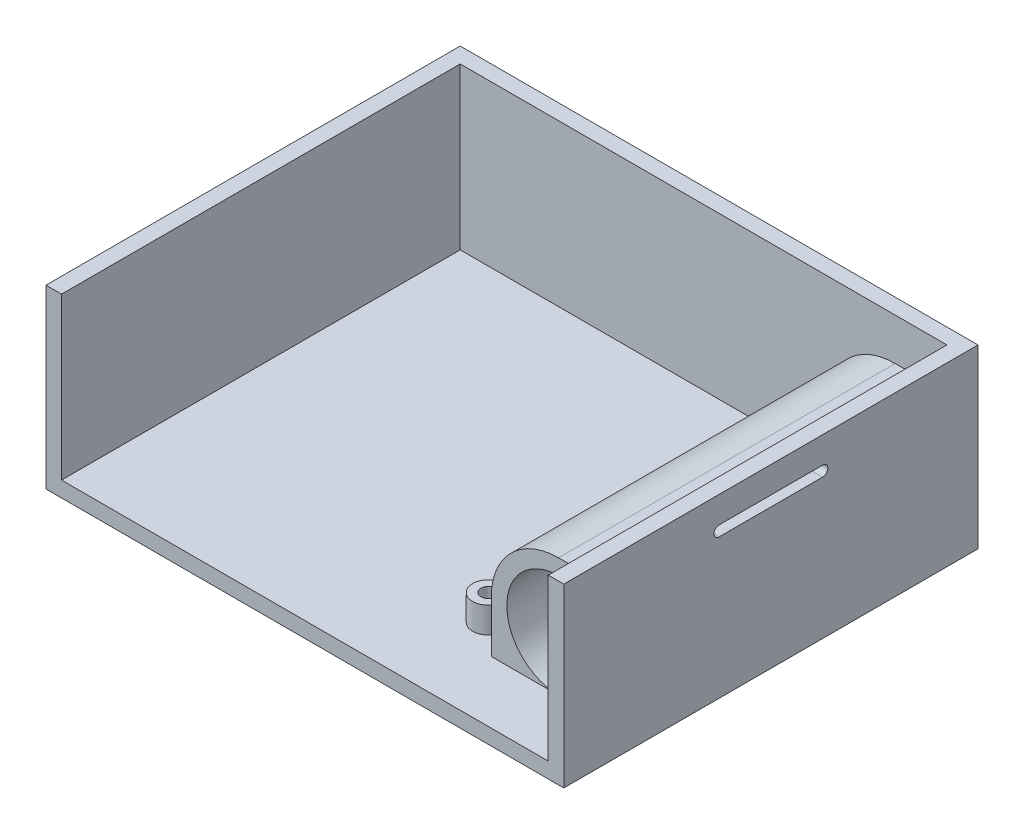
ISO-10303-21;
HEADER;
FILE_DESCRIPTION(('STEP AP214'),'2;1');
FILE_NAME('part.step','',(''),(''),'','','');
FILE_SCHEMA(('AUTOMOTIVE_DESIGN { 1 0 10303 214 1 1 1 1 }'));
ENDSEC;
DATA;
#1=APPLICATION_CONTEXT('core data for automotive mechanical design processes');
#2=APPLICATION_PROTOCOL_DEFINITION('international standard','automotive_design',2000,#1);
#3=PRODUCT_CONTEXT('',#1,'mechanical');
#4=PRODUCT('Part','Part','',(#3));
#5=PRODUCT_RELATED_PRODUCT_CATEGORY('part','',(#4));
#6=PRODUCT_DEFINITION_FORMATION('','',#4);
#7=PRODUCT_DEFINITION_CONTEXT('part definition',#1,'design');
#8=PRODUCT_DEFINITION('design','',#6,#7);
#9=PRODUCT_DEFINITION_SHAPE('','',#8);
#10=(LENGTH_UNIT() NAMED_UNIT(*) SI_UNIT(.MILLI.,.METRE.));
#11=(NAMED_UNIT(*) PLANE_ANGLE_UNIT() SI_UNIT($,.RADIAN.));
#12=(NAMED_UNIT(*) SI_UNIT($,.STERADIAN.) SOLID_ANGLE_UNIT());
#13=UNCERTAINTY_MEASURE_WITH_UNIT(LENGTH_MEASURE(1.E-05),#10,'distance_accuracy_value','');
#14=(GEOMETRIC_REPRESENTATION_CONTEXT(3) GLOBAL_UNCERTAINTY_ASSIGNED_CONTEXT((#13)) GLOBAL_UNIT_ASSIGNED_CONTEXT((#10,
#11,#12)) REPRESENTATION_CONTEXT('',''));
#15=CARTESIAN_POINT('',(0.,0.,0.));
#16=DIRECTION('',(0.,0.,1.));
#17=DIRECTION('',(1.,0.,0.));
#18=AXIS2_PLACEMENT_3D('',#15,#16,#17);
#19=CARTESIAN_POINT('',(0.,3.,0.));
#20=DIRECTION('',(0.,-1.,0.));
#21=DIRECTION('',(0.,0.,-1.));
#22=AXIS2_PLACEMENT_3D('',#19,#20,#21);
#23=PLANE('',#22);
#24=CARTESIAN_POINT('',(18.,3.,22.6));
#25=DIRECTION('',(0.,-1.,0.));
#26=DIRECTION('',(0.,0.,-1.));
#27=AXIS2_PLACEMENT_3D('',#24,#25,#26);
#28=CIRCLE('',#27,3.);
#29=CARTESIAN_POINT('',(18.,3.,19.6));
#30=VERTEX_POINT('',#29);
#31=EDGE_CURVE('E12',#30,#30,#28,.F.);
#32=ORIENTED_EDGE('',*,*,#31,.F.);
#33=EDGE_LOOP('',(#32));
#34=FACE_BOUND('',#33,.T.);
#35=CARTESIAN_POINT('',(18.,3.,-22.));
#36=DIRECTION('',(0.,-1.,0.));
#37=DIRECTION('',(0.,0.,-1.));
#38=AXIS2_PLACEMENT_3D('',#35,#36,#37);
#39=CIRCLE('',#38,3.);
#40=CARTESIAN_POINT('',(18.,3.,-25.));
#41=VERTEX_POINT('',#40);
#42=EDGE_CURVE('E70',#41,#41,#39,.F.);
#43=ORIENTED_EDGE('',*,*,#42,.F.);
#44=EDGE_LOOP('',(#43));
#45=FACE_BOUND('',#44,.T.);
#46=DIRECTION('',(0.,0.,1.));
#47=VECTOR('',#46,1.);
#48=CARTESIAN_POINT('',(47.,3.,-37.));
#49=LINE('',#48,#47);
#50=CARTESIAN_POINT('',(47.,3.,28.));
#51=VERTEX_POINT('',#50);
#52=CARTESIAN_POINT('',(47.,3.,40.));
#53=VERTEX_POINT('',#52);
#54=EDGE_CURVE('E283',#51,#53,#49,.T.);
#55=ORIENTED_EDGE('',*,*,#54,.F.);
#56=DIRECTION('',(1.,0.,0.));
#57=VECTOR('',#56,1.);
#58=CARTESIAN_POINT('',(0.,3.,28.));
#59=LINE('',#58,#57);
#60=CARTESIAN_POINT('',(37.,3.,28.));
#61=VERTEX_POINT('',#60);
#62=EDGE_CURVE('E239',#61,#51,#59,.T.);
#63=ORIENTED_EDGE('',*,*,#62,.F.);
#64=DIRECTION('',(1.,0.,0.));
#65=VECTOR('',#64,1.);
#66=CARTESIAN_POINT('',(0.,3.,28.));
#67=LINE('',#66,#65);
#68=CARTESIAN_POINT('',(24.,3.,28.));
#69=VERTEX_POINT('',#68);
#70=EDGE_CURVE('E252',#69,#61,#67,.T.);
#71=ORIENTED_EDGE('',*,*,#70,.F.);
#72=DIRECTION('',(0.,0.,-1.));
#73=VECTOR('',#72,1.);
#74=CARTESIAN_POINT('',(24.,3.,28.));
#75=LINE('',#74,#73);
#76=CARTESIAN_POINT('',(24.,3.,-37.));
#77=VERTEX_POINT('',#76);
#78=EDGE_CURVE('E270',#69,#77,#75,.T.);
#79=ORIENTED_EDGE('',*,*,#78,.T.);
#80=DIRECTION('',(1.,0.,0.));
#81=VECTOR('',#80,1.);
#82=CARTESIAN_POINT('',(-47.,3.,-37.));
#83=LINE('',#82,#81);
#84=CARTESIAN_POINT('',(-47.,3.,-37.));
#85=VERTEX_POINT('',#84);
#86=EDGE_CURVE('E303',#85,#77,#83,.T.);
#87=ORIENTED_EDGE('',*,*,#86,.F.);
#88=DIRECTION('',(0.,0.,-1.));
#89=VECTOR('',#88,1.);
#90=CARTESIAN_POINT('',(-47.,3.,-37.));
#91=LINE('',#90,#89);
#92=CARTESIAN_POINT('',(-47.,3.,40.));
#93=VERTEX_POINT('',#92);
#94=EDGE_CURVE('E278',#93,#85,#91,.T.);
#95=ORIENTED_EDGE('',*,*,#94,.F.);
#96=DIRECTION('',(1.,0.,0.));
#97=VECTOR('',#96,1.);
#98=CARTESIAN_POINT('',(-50.,3.,40.));
#99=LINE('',#98,#97);
#100=EDGE_CURVE('E319',#93,#53,#99,.T.);
#101=ORIENTED_EDGE('',*,*,#100,.T.);
#102=EDGE_LOOP('',(#55,#63,#71,#79,#87,#95,#101));
#103=FACE_BOUND('',#102,.T.);
#104=ADVANCED_FACE('F62',(#34,#45,#103),#23,.F.);
#105=CARTESIAN_POINT('',(-47.,34.1,-37.));
#106=DIRECTION('',(0.,0.,-1.));
#107=DIRECTION('',(-1.,0.,0.));
#108=AXIS2_PLACEMENT_3D('',#105,#106,#107);
#109=PLANE('',#108);
#110=CARTESIAN_POINT('',(37.,13.,-37.));
#111=DIRECTION('',(0.,0.,1.));
#112=DIRECTION('',(1.,0.,0.));
#113=AXIS2_PLACEMENT_3D('',#110,#111,#112);
#114=CIRCLE('',#113,13.);
#115=CARTESIAN_POINT('',(37.,26.,-37.));
#116=VERTEX_POINT('',#115);
#117=CARTESIAN_POINT('',(24.,13.,-37.));
#118=VERTEX_POINT('',#117);
#119=EDGE_CURVE('E263',#116,#118,#114,.T.);
#120=ORIENTED_EDGE('',*,*,#119,.F.);
#121=DIRECTION('',(1.,0.,0.));
#122=VECTOR('',#121,1.);
#123=CARTESIAN_POINT('',(0.,26.,-37.));
#124=LINE('',#123,#122);
#125=CARTESIAN_POINT('',(47.,26.,-37.));
#126=VERTEX_POINT('',#125);
#127=EDGE_CURVE('E238',#116,#126,#124,.T.);
#128=ORIENTED_EDGE('',*,*,#127,.T.);
#129=DIRECTION('',(0.,-1.,0.));
#130=VECTOR('',#129,1.);
#131=CARTESIAN_POINT('',(47.,34.1,-37.));
#132=LINE('',#131,#130);
#133=CARTESIAN_POINT('',(47.,34.1,-37.));
#134=VERTEX_POINT('',#133);
#135=EDGE_CURVE('E309',#134,#126,#132,.T.);
#136=ORIENTED_EDGE('',*,*,#135,.F.);
#137=DIRECTION('',(1.,0.,0.));
#138=VECTOR('',#137,1.);
#139=CARTESIAN_POINT('',(-47.,34.1,-37.));
#140=LINE('',#139,#138);
#141=CARTESIAN_POINT('',(-47.,34.1,-37.));
#142=VERTEX_POINT('',#141);
#143=EDGE_CURVE('E296',#142,#134,#140,.T.);
#144=ORIENTED_EDGE('',*,*,#143,.F.);
#145=DIRECTION('',(0.,-1.,0.));
#146=VECTOR('',#145,1.);
#147=CARTESIAN_POINT('',(-47.,34.1,-37.));
#148=LINE('',#147,#146);
#149=EDGE_CURVE('E312',#142,#85,#148,.T.);
#150=ORIENTED_EDGE('',*,*,#149,.T.);
#151=ORIENTED_EDGE('',*,*,#86,.T.);
#152=DIRECTION('',(0.,-1.,0.));
#153=VECTOR('',#152,1.);
#154=CARTESIAN_POINT('',(24.,0.,-37.));
#155=LINE('',#154,#153);
#156=EDGE_CURVE('E265',#118,#77,#155,.T.);
#157=ORIENTED_EDGE('',*,*,#156,.F.);
#158=EDGE_LOOP('',(#120,#128,#136,#144,#150,#151,#157));
#159=FACE_BOUND('',#158,.T.);
#160=ADVANCED_FACE('F348',(#159),#109,.F.);
#161=CARTESIAN_POINT('',(50.,3.,40.));
#162=DIRECTION('',(-1.,0.,0.));
#163=DIRECTION('',(0.,0.,1.));
#164=AXIS2_PLACEMENT_3D('',#161,#162,#163);
#165=PLANE('',#164);
#166=DIRECTION('',(0.,0.,-1.));
#167=VECTOR('',#166,1.);
#168=CARTESIAN_POINT('',(50.,29.,-10.));
#169=LINE('',#168,#167);
#170=CARTESIAN_POINT('',(50.,29.,10.));
#171=VERTEX_POINT('',#170);
#172=CARTESIAN_POINT('',(50.,29.,-10.));
#173=VERTEX_POINT('',#172);
#174=EDGE_CURVE('E189',#171,#173,#169,.T.);
#175=ORIENTED_EDGE('',*,*,#174,.T.);
#176=CARTESIAN_POINT('',(50.,28.,-10.));
#177=DIRECTION('',(-1.,0.,0.));
#178=DIRECTION('',(0.,0.,1.));
#179=AXIS2_PLACEMENT_3D('',#176,#177,#178);
#180=CIRCLE('',#179,1.);
#181=CARTESIAN_POINT('',(50.,27.,-10.));
#182=VERTEX_POINT('',#181);
#183=EDGE_CURVE('E183',#173,#182,#180,.T.);
#184=ORIENTED_EDGE('',*,*,#183,.T.);
#185=DIRECTION('',(0.,0.,1.));
#186=VECTOR('',#185,1.);
#187=CARTESIAN_POINT('',(50.,27.,-10.));
#188=LINE('',#187,#186);
#189=CARTESIAN_POINT('',(50.,27.,10.));
#190=VERTEX_POINT('',#189);
#191=EDGE_CURVE('E192',#182,#190,#188,.T.);
#192=ORIENTED_EDGE('',*,*,#191,.T.);
#193=CARTESIAN_POINT('',(50.,28.,10.));
#194=DIRECTION('',(-1.,0.,0.));
#195=DIRECTION('',(0.,0.,1.));
#196=AXIS2_PLACEMENT_3D('',#193,#194,#195);
#197=CIRCLE('',#196,1.);
#198=EDGE_CURVE('E77',#190,#171,#197,.T.);
#199=ORIENTED_EDGE('',*,*,#198,.T.);
#200=EDGE_LOOP('',(#175,#184,#192,#199));
#201=FACE_BOUND('',#200,.T.);
#202=DIRECTION('',(0.,0.,-1.));
#203=VECTOR('',#202,1.);
#204=CARTESIAN_POINT('',(50.,0.,40.));
#205=LINE('',#204,#203);
#206=CARTESIAN_POINT('',(50.,0.,40.));
#207=VERTEX_POINT('',#206);
#208=CARTESIAN_POINT('',(50.,0.,-40.));
#209=VERTEX_POINT('',#208);
#210=EDGE_CURVE('E318',#207,#209,#205,.T.);
#211=ORIENTED_EDGE('',*,*,#210,.T.);
#212=DIRECTION('',(0.,-1.,0.));
#213=VECTOR('',#212,1.);
#214=CARTESIAN_POINT('',(50.,3.,-40.));
#215=LINE('',#214,#213);
#216=CARTESIAN_POINT('',(50.,34.1,-40.));
#217=VERTEX_POINT('',#216);
#218=EDGE_CURVE('E339',#217,#209,#215,.T.);
#219=ORIENTED_EDGE('',*,*,#218,.F.);
#220=DIRECTION('',(0.,0.,-1.));
#221=VECTOR('',#220,1.);
#222=CARTESIAN_POINT('',(50.,34.1,-40.));
#223=LINE('',#222,#221);
#224=CARTESIAN_POINT('',(50.,34.1,40.));
#225=VERTEX_POINT('',#224);
#226=EDGE_CURVE('E282',#225,#217,#223,.T.);
#227=ORIENTED_EDGE('',*,*,#226,.F.);
#228=DIRECTION('',(0.,-1.,0.));
#229=VECTOR('',#228,1.);
#230=CARTESIAN_POINT('',(50.,3.,40.));
#231=LINE('',#230,#229);
#232=EDGE_CURVE('E322',#225,#207,#231,.T.);
#233=ORIENTED_EDGE('',*,*,#232,.T.);
#234=EDGE_LOOP('',(#211,#219,#227,#233));
#235=FACE_BOUND('',#234,.T.);
#236=ADVANCED_FACE('F64',(#201,#235),#165,.F.);
#237=CARTESIAN_POINT('',(-50.,3.,-40.));
#238=DIRECTION('',(0.,0.,1.));
#239=DIRECTION('',(1.,0.,0.));
#240=AXIS2_PLACEMENT_3D('',#237,#238,#239);
#241=PLANE('',#240);
#242=DIRECTION('',(-1.,0.,0.));
#243=VECTOR('',#242,1.);
#244=CARTESIAN_POINT('',(-50.,0.,-40.));
#245=LINE('',#244,#243);
#246=CARTESIAN_POINT('',(-50.,0.,-40.));
#247=VERTEX_POINT('',#246);
#248=EDGE_CURVE('E326',#209,#247,#245,.T.);
#249=ORIENTED_EDGE('',*,*,#248,.T.);
#250=DIRECTION('',(0.,-1.,0.));
#251=VECTOR('',#250,1.);
#252=CARTESIAN_POINT('',(-50.,3.,-40.));
#253=LINE('',#252,#251);
#254=CARTESIAN_POINT('',(-50.,34.1,-40.));
#255=VERTEX_POINT('',#254);
#256=EDGE_CURVE('E336',#255,#247,#253,.T.);
#257=ORIENTED_EDGE('',*,*,#256,.F.);
#258=DIRECTION('',(-1.,0.,0.));
#259=VECTOR('',#258,1.);
#260=CARTESIAN_POINT('',(-50.,34.1,-40.));
#261=LINE('',#260,#259);
#262=EDGE_CURVE('E286',#217,#255,#261,.T.);
#263=ORIENTED_EDGE('',*,*,#262,.F.);
#264=ORIENTED_EDGE('',*,*,#218,.T.);
#265=EDGE_LOOP('',(#249,#257,#263,#264));
#266=FACE_BOUND('',#265,.T.);
#267=ADVANCED_FACE('F407',(#266),#241,.F.);
#268=CARTESIAN_POINT('',(-50.,3.,40.));
#269=DIRECTION('',(1.,0.,0.));
#270=DIRECTION('',(0.,0.,-1.));
#271=AXIS2_PLACEMENT_3D('',#268,#269,#270);
#272=PLANE('',#271);
#273=DIRECTION('',(0.,0.,1.));
#274=VECTOR('',#273,1.);
#275=CARTESIAN_POINT('',(-50.,0.,40.));
#276=LINE('',#275,#274);
#277=CARTESIAN_POINT('',(-50.,0.,40.));
#278=VERTEX_POINT('',#277);
#279=EDGE_CURVE('E328',#247,#278,#276,.T.);
#280=ORIENTED_EDGE('',*,*,#279,.T.);
#281=DIRECTION('',(0.,-1.,0.));
#282=VECTOR('',#281,1.);
#283=CARTESIAN_POINT('',(-50.,3.,40.));
#284=LINE('',#283,#282);
#285=CARTESIAN_POINT('',(-50.,34.1,40.));
#286=VERTEX_POINT('',#285);
#287=EDGE_CURVE('E333',#286,#278,#284,.T.);
#288=ORIENTED_EDGE('',*,*,#287,.F.);
#289=DIRECTION('',(0.,0.,1.));
#290=VECTOR('',#289,1.);
#291=CARTESIAN_POINT('',(-50.,34.1,-40.));
#292=LINE('',#291,#290);
#293=EDGE_CURVE('E289',#255,#286,#292,.T.);
#294=ORIENTED_EDGE('',*,*,#293,.F.);
#295=ORIENTED_EDGE('',*,*,#256,.T.);
#296=EDGE_LOOP('',(#280,#288,#294,#295));
#297=FACE_BOUND('',#296,.T.);
#298=ADVANCED_FACE('F408',(#297),#272,.F.);
#299=CARTESIAN_POINT('',(-50.,3.,40.));
#300=DIRECTION('',(0.,0.,-1.));
#301=DIRECTION('',(-1.,0.,0.));
#302=AXIS2_PLACEMENT_3D('',#299,#300,#301);
#303=PLANE('',#302);
#304=DIRECTION('',(1.,0.,0.));
#305=VECTOR('',#304,1.);
#306=CARTESIAN_POINT('',(-50.,0.,40.));
#307=LINE('',#306,#305);
#308=EDGE_CURVE('E323',#278,#207,#307,.T.);
#309=ORIENTED_EDGE('',*,*,#308,.T.);
#310=ORIENTED_EDGE('',*,*,#232,.F.);
#311=DIRECTION('',(1.,0.,0.));
#312=VECTOR('',#311,1.);
#313=CARTESIAN_POINT('',(47.,34.1,40.));
#314=LINE('',#313,#312);
#315=CARTESIAN_POINT('',(47.,34.1,40.));
#316=VERTEX_POINT('',#315);
#317=EDGE_CURVE('E279',#316,#225,#314,.T.);
#318=ORIENTED_EDGE('',*,*,#317,.F.);
#319=DIRECTION('',(0.,-1.,0.));
#320=VECTOR('',#319,1.);
#321=CARTESIAN_POINT('',(47.,34.1,40.));
#322=LINE('',#321,#320);
#323=EDGE_CURVE('E300',#316,#53,#322,.T.);
#324=ORIENTED_EDGE('',*,*,#323,.T.);
#325=ORIENTED_EDGE('',*,*,#100,.F.);
#326=DIRECTION('',(0.,-1.,0.));
#327=VECTOR('',#326,1.);
#328=CARTESIAN_POINT('',(-47.,34.1,40.));
#329=LINE('',#328,#327);
#330=CARTESIAN_POINT('',(-47.,34.1,40.));
#331=VERTEX_POINT('',#330);
#332=EDGE_CURVE('E315',#331,#93,#329,.T.);
#333=ORIENTED_EDGE('',*,*,#332,.F.);
#334=DIRECTION('',(1.,0.,0.));
#335=VECTOR('',#334,1.);
#336=CARTESIAN_POINT('',(-50.,34.1,40.));
#337=LINE('',#336,#335);
#338=EDGE_CURVE('E292',#286,#331,#337,.T.);
#339=ORIENTED_EDGE('',*,*,#338,.F.);
#340=ORIENTED_EDGE('',*,*,#287,.T.);
#341=EDGE_LOOP('',(#309,#310,#318,#324,#325,#333,#339,#340));
#342=FACE_BOUND('',#341,.T.);
#343=ADVANCED_FACE('F392',(#342),#303,.F.);
#344=CARTESIAN_POINT('',(0.,0.,0.));
#345=DIRECTION('',(0.,-1.,0.));
#346=DIRECTION('',(0.,0.,-1.));
#347=AXIS2_PLACEMENT_3D('',#344,#345,#346);
#348=PLANE('',#347);
#349=ORIENTED_EDGE('',*,*,#210,.F.);
#350=ORIENTED_EDGE('',*,*,#308,.F.);
#351=ORIENTED_EDGE('',*,*,#279,.F.);
#352=ORIENTED_EDGE('',*,*,#248,.F.);
#353=EDGE_LOOP('',(#349,#350,#351,#352));
#354=FACE_BOUND('',#353,.T.);
#355=ADVANCED_FACE('F403',(#354),#348,.T.);
#356=CARTESIAN_POINT('',(-47.,34.1,-37.));
#357=DIRECTION('',(-1.,0.,0.));
#358=DIRECTION('',(0.,0.,1.));
#359=AXIS2_PLACEMENT_3D('',#356,#357,#358);
#360=PLANE('',#359);
#361=ORIENTED_EDGE('',*,*,#94,.T.);
#362=ORIENTED_EDGE('',*,*,#149,.F.);
#363=DIRECTION('',(0.,0.,-1.));
#364=VECTOR('',#363,1.);
#365=CARTESIAN_POINT('',(-47.,34.1,-37.));
#366=LINE('',#365,#364);
#367=EDGE_CURVE('E294',#331,#142,#366,.T.);
#368=ORIENTED_EDGE('',*,*,#367,.F.);
#369=ORIENTED_EDGE('',*,*,#332,.T.);
#370=EDGE_LOOP('',(#361,#362,#368,#369));
#371=FACE_BOUND('',#370,.T.);
#372=ADVANCED_FACE('F389',(#371),#360,.F.);
#373=CARTESIAN_POINT('',(37.,13.,-37.));
#374=DIRECTION('',(0.,0.,1.));
#375=DIRECTION('',(1.,0.,0.));
#376=AXIS2_PLACEMENT_3D('',#373,#374,#375);
#377=CIRCLE('',#376,10.);
#378=CARTESIAN_POINT('',(47.,13.,-37.));
#379=VERTEX_POINT('',#378);
#380=EDGE_CURVE('E248',#379,#379,#377,.T.);
#381=ORIENTED_EDGE('',*,*,#380,.T.);
#382=EDGE_LOOP('',(#381));
#383=FACE_BOUND('',#382,.T.);
#384=ADVANCED_FACE('F421',(#383),#109,.F.);
#385=CARTESIAN_POINT('',(47.,34.1,-37.));
#386=DIRECTION('',(1.,0.,0.));
#387=DIRECTION('',(0.,0.,-1.));
#388=AXIS2_PLACEMENT_3D('',#385,#386,#387);
#389=PLANE('',#388);
#390=DIRECTION('',(0.,0.,1.));
#391=VECTOR('',#390,1.);
#392=CARTESIAN_POINT('',(47.,27.,-10.));
#393=LINE('',#392,#391);
#394=CARTESIAN_POINT('',(47.,27.,-10.));
#395=VERTEX_POINT('',#394);
#396=CARTESIAN_POINT('',(47.,27.,10.));
#397=VERTEX_POINT('',#396);
#398=EDGE_CURVE('E207',#395,#397,#393,.T.);
#399=ORIENTED_EDGE('',*,*,#398,.F.);
#400=CARTESIAN_POINT('',(47.,28.,-10.));
#401=DIRECTION('',(-1.,0.,0.));
#402=DIRECTION('',(0.,0.,1.));
#403=AXIS2_PLACEMENT_3D('',#400,#401,#402);
#404=CIRCLE('',#403,1.);
#405=CARTESIAN_POINT('',(47.,29.,-10.));
#406=VERTEX_POINT('',#405);
#407=EDGE_CURVE('E85',#406,#395,#404,.T.);
#408=ORIENTED_EDGE('',*,*,#407,.F.);
#409=DIRECTION('',(0.,0.,-1.));
#410=VECTOR('',#409,1.);
#411=CARTESIAN_POINT('',(47.,29.,-10.));
#412=LINE('',#411,#410);
#413=CARTESIAN_POINT('',(47.,29.,10.));
#414=VERTEX_POINT('',#413);
#415=EDGE_CURVE('E198',#414,#406,#412,.T.);
#416=ORIENTED_EDGE('',*,*,#415,.F.);
#417=CARTESIAN_POINT('',(47.,28.,10.));
#418=DIRECTION('',(-1.,0.,0.));
#419=DIRECTION('',(0.,0.,1.));
#420=AXIS2_PLACEMENT_3D('',#417,#418,#419);
#421=CIRCLE('',#420,1.);
#422=EDGE_CURVE('E201',#397,#414,#421,.T.);
#423=ORIENTED_EDGE('',*,*,#422,.F.);
#424=EDGE_LOOP('',(#399,#408,#416,#423));
#425=FACE_BOUND('',#424,.T.);
#426=DIRECTION('',(0.,1.,0.));
#427=VECTOR('',#426,1.);
#428=CARTESIAN_POINT('',(47.,0.,28.));
#429=LINE('',#428,#427);
#430=CARTESIAN_POINT('',(47.,13.,28.));
#431=VERTEX_POINT('',#430);
#432=CARTESIAN_POINT('',(47.,26.,28.));
#433=VERTEX_POINT('',#432);
#434=EDGE_CURVE('E258',#431,#433,#429,.T.);
#435=ORIENTED_EDGE('',*,*,#434,.F.);
#436=DIRECTION('',(0.,1.,0.));
#437=VECTOR('',#436,1.);
#438=CARTESIAN_POINT('',(47.,0.,28.));
#439=LINE('',#438,#437);
#440=EDGE_CURVE('E235',#51,#431,#439,.T.);
#441=ORIENTED_EDGE('',*,*,#440,.F.);
#442=ORIENTED_EDGE('',*,*,#54,.T.);
#443=ORIENTED_EDGE('',*,*,#323,.F.);
#444=DIRECTION('',(0.,0.,1.));
#445=VECTOR('',#444,1.);
#446=CARTESIAN_POINT('',(47.,34.1,-37.));
#447=LINE('',#446,#445);
#448=EDGE_CURVE('E298',#134,#316,#447,.T.);
#449=ORIENTED_EDGE('',*,*,#448,.F.);
#450=ORIENTED_EDGE('',*,*,#135,.T.);
#451=DIRECTION('',(0.,0.,-1.));
#452=VECTOR('',#451,1.);
#453=CARTESIAN_POINT('',(47.,26.,28.));
#454=LINE('',#453,#452);
#455=EDGE_CURVE('E260',#433,#126,#454,.T.);
#456=ORIENTED_EDGE('',*,*,#455,.F.);
#457=EDGE_LOOP('',(#435,#441,#442,#443,#449,#450,#456));
#458=FACE_BOUND('',#457,.T.);
#459=ADVANCED_FACE('F368',(#425,#458),#389,.F.);
#460=CARTESIAN_POINT('',(0.,34.1,0.));
#461=DIRECTION('',(0.,-1.,0.));
#462=DIRECTION('',(0.,0.,-1.));
#463=AXIS2_PLACEMENT_3D('',#460,#461,#462);
#464=PLANE('',#463);
#465=ORIENTED_EDGE('',*,*,#317,.T.);
#466=ORIENTED_EDGE('',*,*,#226,.T.);
#467=ORIENTED_EDGE('',*,*,#262,.T.);
#468=ORIENTED_EDGE('',*,*,#293,.T.);
#469=ORIENTED_EDGE('',*,*,#338,.T.);
#470=ORIENTED_EDGE('',*,*,#367,.T.);
#471=ORIENTED_EDGE('',*,*,#143,.T.);
#472=ORIENTED_EDGE('',*,*,#448,.T.);
#473=EDGE_LOOP('',(#465,#466,#467,#468,#469,#470,#471,#472));
#474=FACE_BOUND('',#473,.T.);
#475=ADVANCED_FACE('F396',(#474),#464,.F.);
#476=CARTESIAN_POINT('',(0.,26.,28.));
#477=DIRECTION('',(0.,1.,0.));
#478=DIRECTION('',(0.,0.,1.));
#479=AXIS2_PLACEMENT_3D('',#476,#477,#478);
#480=PLANE('',#479);
#481=ORIENTED_EDGE('',*,*,#127,.F.);
#482=DIRECTION('',(0.,0.,-1.));
#483=VECTOR('',#482,1.);
#484=CARTESIAN_POINT('',(37.,26.,28.));
#485=LINE('',#484,#483);
#486=CARTESIAN_POINT('',(37.,26.,28.));
#487=VERTEX_POINT('',#486);
#488=EDGE_CURVE('E276',#487,#116,#485,.T.);
#489=ORIENTED_EDGE('',*,*,#488,.F.);
#490=DIRECTION('',(1.,0.,0.));
#491=VECTOR('',#490,1.);
#492=CARTESIAN_POINT('',(0.,26.,28.));
#493=LINE('',#492,#491);
#494=EDGE_CURVE('E244',#487,#433,#493,.T.);
#495=ORIENTED_EDGE('',*,*,#494,.T.);
#496=ORIENTED_EDGE('',*,*,#455,.T.);
#497=EDGE_LOOP('',(#481,#489,#495,#496));
#498=FACE_BOUND('',#497,.T.);
#499=ADVANCED_FACE('F373',(#498),#480,.T.);
#500=CARTESIAN_POINT('',(37.,13.,28.));
#501=DIRECTION('',(0.,0.,-1.));
#502=DIRECTION('',(-1.,0.,0.));
#503=AXIS2_PLACEMENT_3D('',#500,#501,#502);
#504=CYLINDRICAL_SURFACE('',#503,13.);
#505=ORIENTED_EDGE('',*,*,#119,.T.);
#506=DIRECTION('',(0.,0.,-1.));
#507=VECTOR('',#506,1.);
#508=CARTESIAN_POINT('',(24.,13.,28.));
#509=LINE('',#508,#507);
#510=CARTESIAN_POINT('',(24.,13.,28.));
#511=VERTEX_POINT('',#510);
#512=EDGE_CURVE('E273',#511,#118,#509,.T.);
#513=ORIENTED_EDGE('',*,*,#512,.F.);
#514=CARTESIAN_POINT('',(37.,13.,28.));
#515=DIRECTION('',(0.,0.,1.));
#516=DIRECTION('',(1.,0.,0.));
#517=AXIS2_PLACEMENT_3D('',#514,#515,#516);
#518=CIRCLE('',#517,13.);
#519=EDGE_CURVE('E247',#487,#511,#518,.T.);
#520=ORIENTED_EDGE('',*,*,#519,.F.);
#521=ORIENTED_EDGE('',*,*,#488,.T.);
#522=EDGE_LOOP('',(#505,#513,#520,#521));
#523=FACE_BOUND('',#522,.T.);
#524=ADVANCED_FACE('F380',(#523),#504,.T.);
#525=CARTESIAN_POINT('',(24.,0.,28.));
#526=DIRECTION('',(1.,0.,0.));
#527=DIRECTION('',(0.,1.,0.));
#528=AXIS2_PLACEMENT_3D('',#525,#526,#527);
#529=PLANE('',#528);
#530=ORIENTED_EDGE('',*,*,#156,.T.);
#531=ORIENTED_EDGE('',*,*,#78,.F.);
#532=DIRECTION('',(0.,-1.,0.));
#533=VECTOR('',#532,1.);
#534=CARTESIAN_POINT('',(24.,0.,28.));
#535=LINE('',#534,#533);
#536=EDGE_CURVE('E250',#511,#69,#535,.T.);
#537=ORIENTED_EDGE('',*,*,#536,.F.);
#538=ORIENTED_EDGE('',*,*,#512,.T.);
#539=EDGE_LOOP('',(#530,#531,#537,#538));
#540=FACE_BOUND('',#539,.T.);
#541=ADVANCED_FACE('F384',(#540),#529,.F.);
#542=CARTESIAN_POINT('',(37.,13.,28.));
#543=DIRECTION('',(0.,0.,-1.));
#544=DIRECTION('',(-1.,0.,0.));
#545=AXIS2_PLACEMENT_3D('',#542,#543,#544);
#546=CYLINDRICAL_SURFACE('',#545,10.);
#547=ORIENTED_EDGE('',*,*,#380,.F.);
#548=EDGE_LOOP('',(#547));
#549=FACE_BOUND('',#548,.T.);
#550=CARTESIAN_POINT('',(37.,13.,28.));
#551=DIRECTION('',(0.,0.,1.));
#552=DIRECTION('',(1.,0.,0.));
#553=AXIS2_PLACEMENT_3D('',#550,#551,#552);
#554=CIRCLE('',#553,10.);
#555=EDGE_CURVE('E255',#431,#61,#554,.T.);
#556=ORIENTED_EDGE('',*,*,#555,.T.);
#557=CARTESIAN_POINT('',(37.,13.,28.));
#558=DIRECTION('',(0.,0.,1.));
#559=DIRECTION('',(1.,0.,0.));
#560=AXIS2_PLACEMENT_3D('',#557,#558,#559);
#561=CIRCLE('',#560,10.);
#562=EDGE_CURVE('E234',#61,#431,#561,.T.);
#563=ORIENTED_EDGE('',*,*,#562,.T.);
#564=EDGE_LOOP('',(#556,#563));
#565=FACE_BOUND('',#564,.T.);
#566=ADVANCED_FACE('F362',(#549,#565),#546,.F.);
#567=CARTESIAN_POINT('',(0.,0.,28.));
#568=DIRECTION('',(0.,0.,1.));
#569=DIRECTION('',(1.,0.,0.));
#570=AXIS2_PLACEMENT_3D('',#567,#568,#569);
#571=PLANE('',#570);
#572=ORIENTED_EDGE('',*,*,#494,.F.);
#573=ORIENTED_EDGE('',*,*,#519,.T.);
#574=ORIENTED_EDGE('',*,*,#536,.T.);
#575=ORIENTED_EDGE('',*,*,#70,.T.);
#576=ORIENTED_EDGE('',*,*,#555,.F.);
#577=ORIENTED_EDGE('',*,*,#434,.T.);
#578=EDGE_LOOP('',(#572,#573,#574,#575,#576,#577));
#579=FACE_BOUND('',#578,.T.);
#580=ADVANCED_FACE('F366',(#579),#571,.T.);
#581=CARTESIAN_POINT('',(0.,0.,28.));
#582=DIRECTION('',(0.,0.,1.));
#583=DIRECTION('',(1.,0.,0.));
#584=AXIS2_PLACEMENT_3D('',#581,#582,#583);
#585=PLANE('',#584);
#586=ORIENTED_EDGE('',*,*,#562,.F.);
#587=ORIENTED_EDGE('',*,*,#62,.T.);
#588=ORIENTED_EDGE('',*,*,#440,.T.);
#589=EDGE_LOOP('',(#586,#587,#588));
#590=FACE_BOUND('',#589,.T.);
#591=ADVANCED_FACE('F360',(#590),#585,.T.);
#592=CARTESIAN_POINT('',(18.,8.,-22.));
#593=DIRECTION('',(0.,1.,0.));
#594=DIRECTION('',(0.,0.,1.));
#595=AXIS2_PLACEMENT_3D('',#592,#593,#594);
#596=PLANE('',#595);
#597=CARTESIAN_POINT('',(18.,8.,-22.));
#598=DIRECTION('',(0.,1.,0.));
#599=DIRECTION('',(0.,0.,1.));
#600=AXIS2_PLACEMENT_3D('',#597,#598,#599);
#601=CIRCLE('',#600,3.);
#602=CARTESIAN_POINT('',(18.,8.,-19.));
#603=VERTEX_POINT('',#602);
#604=EDGE_CURVE('E229',#603,#603,#601,.T.);
#605=ORIENTED_EDGE('',*,*,#604,.T.);
#606=EDGE_LOOP('',(#605));
#607=FACE_BOUND('',#606,.T.);
#608=CARTESIAN_POINT('',(18.,8.,-22.));
#609=DIRECTION('',(0.,1.,0.));
#610=DIRECTION('',(0.,0.,1.));
#611=AXIS2_PLACEMENT_3D('',#608,#609,#610);
#612=CIRCLE('',#611,1.425);
#613=CARTESIAN_POINT('',(18.,8.,-20.575));
#614=VERTEX_POINT('',#613);
#615=EDGE_CURVE('E226',#614,#614,#612,.T.);
#616=ORIENTED_EDGE('',*,*,#615,.F.);
#617=EDGE_LOOP('',(#616));
#618=FACE_BOUND('',#617,.T.);
#619=ADVANCED_FACE('F443',(#607,#618),#596,.T.);
#620=CARTESIAN_POINT('',(18.,8.,-22.));
#621=DIRECTION('',(0.,-1.,0.));
#622=DIRECTION('',(0.,0.,-1.));
#623=AXIS2_PLACEMENT_3D('',#620,#621,#622);
#624=CYLINDRICAL_SURFACE('',#623,3.);
#625=ORIENTED_EDGE('',*,*,#604,.F.);
#626=EDGE_LOOP('',(#625));
#627=FACE_BOUND('',#626,.T.);
#628=ORIENTED_EDGE('',*,*,#42,.T.);
#629=EDGE_LOOP('',(#628));
#630=FACE_BOUND('',#629,.T.);
#631=ADVANCED_FACE('F344',(#627,#630),#624,.T.);
#632=CARTESIAN_POINT('',(18.,8.,-22.));
#633=DIRECTION('',(0.,-1.,0.));
#634=DIRECTION('',(0.,0.,-1.));
#635=AXIS2_PLACEMENT_3D('',#632,#633,#634);
#636=CYLINDRICAL_SURFACE('',#635,1.425);
#637=ORIENTED_EDGE('',*,*,#615,.T.);
#638=EDGE_LOOP('',(#637));
#639=FACE_BOUND('',#638,.T.);
#640=CARTESIAN_POINT('',(18.,3.,-22.));
#641=DIRECTION('',(0.,1.,0.));
#642=DIRECTION('',(0.,0.,1.));
#643=AXIS2_PLACEMENT_3D('',#640,#641,#642);
#644=CIRCLE('',#643,1.425);
#645=CARTESIAN_POINT('',(18.,3.,-20.575));
#646=VERTEX_POINT('',#645);
#647=EDGE_CURVE('E225',#646,#646,#644,.T.);
#648=ORIENTED_EDGE('',*,*,#647,.F.);
#649=EDGE_LOOP('',(#648));
#650=FACE_BOUND('',#649,.T.);
#651=ADVANCED_FACE('F446',(#639,#650),#636,.F.);
#652=ORIENTED_EDGE('',*,*,#647,.T.);
#653=EDGE_LOOP('',(#652));
#654=FACE_BOUND('',#653,.T.);
#655=ADVANCED_FACE('F352',(#654),#23,.F.);
#656=CARTESIAN_POINT('',(18.,8.,22.6));
#657=DIRECTION('',(0.,1.,0.));
#658=DIRECTION('',(0.,0.,1.));
#659=AXIS2_PLACEMENT_3D('',#656,#657,#658);
#660=PLANE('',#659);
#661=CARTESIAN_POINT('',(18.,8.,22.6));
#662=DIRECTION('',(0.,1.,0.));
#663=DIRECTION('',(0.,0.,1.));
#664=AXIS2_PLACEMENT_3D('',#661,#662,#663);
#665=CIRCLE('',#664,3.);
#666=CARTESIAN_POINT('',(18.,8.,25.6));
#667=VERTEX_POINT('',#666);
#668=EDGE_CURVE('E220',#667,#667,#665,.T.);
#669=ORIENTED_EDGE('',*,*,#668,.T.);
#670=EDGE_LOOP('',(#669));
#671=FACE_BOUND('',#670,.T.);
#672=CARTESIAN_POINT('',(18.,8.,22.6));
#673=DIRECTION('',(0.,1.,0.));
#674=DIRECTION('',(0.,0.,1.));
#675=AXIS2_PLACEMENT_3D('',#672,#673,#674);
#676=CIRCLE('',#675,1.425);
#677=CARTESIAN_POINT('',(18.,8.,24.025));
#678=VERTEX_POINT('',#677);
#679=EDGE_CURVE('E217',#678,#678,#676,.T.);
#680=ORIENTED_EDGE('',*,*,#679,.F.);
#681=EDGE_LOOP('',(#680));
#682=FACE_BOUND('',#681,.T.);
#683=ADVANCED_FACE('F458',(#671,#682),#660,.T.);
#684=CARTESIAN_POINT('',(18.,8.,22.6));
#685=DIRECTION('',(0.,-1.,0.));
#686=DIRECTION('',(0.,0.,-1.));
#687=AXIS2_PLACEMENT_3D('',#684,#685,#686);
#688=CYLINDRICAL_SURFACE('',#687,3.);
#689=ORIENTED_EDGE('',*,*,#668,.F.);
#690=EDGE_LOOP('',(#689));
#691=FACE_BOUND('',#690,.T.);
#692=ORIENTED_EDGE('',*,*,#31,.T.);
#693=EDGE_LOOP('',(#692));
#694=FACE_BOUND('',#693,.T.);
#695=ADVANCED_FACE('F454',(#691,#694),#688,.T.);
#696=CARTESIAN_POINT('',(18.,8.,22.6));
#697=DIRECTION('',(0.,-1.,0.));
#698=DIRECTION('',(0.,0.,-1.));
#699=AXIS2_PLACEMENT_3D('',#696,#697,#698);
#700=CYLINDRICAL_SURFACE('',#699,1.425);
#701=ORIENTED_EDGE('',*,*,#679,.T.);
#702=EDGE_LOOP('',(#701));
#703=FACE_BOUND('',#702,.T.);
#704=CARTESIAN_POINT('',(18.,3.,22.6));
#705=DIRECTION('',(0.,1.,0.));
#706=DIRECTION('',(0.,0.,1.));
#707=AXIS2_PLACEMENT_3D('',#704,#705,#706);
#708=CIRCLE('',#707,1.425);
#709=CARTESIAN_POINT('',(18.,3.,24.025));
#710=VERTEX_POINT('',#709);
#711=EDGE_CURVE('E213',#710,#710,#708,.T.);
#712=ORIENTED_EDGE('',*,*,#711,.F.);
#713=EDGE_LOOP('',(#712));
#714=FACE_BOUND('',#713,.T.);
#715=ADVANCED_FACE('F457',(#703,#714),#700,.F.);
#716=ORIENTED_EDGE('',*,*,#711,.T.);
#717=EDGE_LOOP('',(#716));
#718=FACE_BOUND('',#717,.T.);
#719=ADVANCED_FACE('F351',(#718),#23,.F.);
#720=CARTESIAN_POINT('',(50.,28.,-10.));
#721=DIRECTION('',(-1.,0.,0.));
#722=DIRECTION('',(0.,0.,1.));
#723=AXIS2_PLACEMENT_3D('',#720,#721,#722);
#724=CYLINDRICAL_SURFACE('',#723,1.);
#725=ORIENTED_EDGE('',*,*,#407,.T.);
#726=DIRECTION('',(-1.,0.,0.));
#727=VECTOR('',#726,1.);
#728=CARTESIAN_POINT('',(50.,27.,-10.));
#729=LINE('',#728,#727);
#730=EDGE_CURVE('E179',#182,#395,#729,.T.);
#731=ORIENTED_EDGE('',*,*,#730,.F.);
#732=ORIENTED_EDGE('',*,*,#183,.F.);
#733=DIRECTION('',(-1.,0.,0.));
#734=VECTOR('',#733,1.);
#735=CARTESIAN_POINT('',(50.,29.,-10.));
#736=LINE('',#735,#734);
#737=EDGE_CURVE('E211',#173,#406,#736,.T.);
#738=ORIENTED_EDGE('',*,*,#737,.T.);
#739=EDGE_LOOP('',(#725,#731,#732,#738));
#740=FACE_BOUND('',#739,.T.);
#741=ADVANCED_FACE('F181',(#740),#724,.F.);
#742=CARTESIAN_POINT('',(50.,29.,-10.));
#743=DIRECTION('',(0.,1.,0.));
#744=DIRECTION('',(0.,0.,1.));
#745=AXIS2_PLACEMENT_3D('',#742,#743,#744);
#746=PLANE('',#745);
#747=ORIENTED_EDGE('',*,*,#415,.T.);
#748=ORIENTED_EDGE('',*,*,#737,.F.);
#749=ORIENTED_EDGE('',*,*,#174,.F.);
#750=DIRECTION('',(-1.,0.,0.));
#751=VECTOR('',#750,1.);
#752=CARTESIAN_POINT('',(50.,29.,10.));
#753=LINE('',#752,#751);
#754=EDGE_CURVE('E214',#171,#414,#753,.T.);
#755=ORIENTED_EDGE('',*,*,#754,.T.);
#756=EDGE_LOOP('',(#747,#748,#749,#755));
#757=FACE_BOUND('',#756,.T.);
#758=ADVANCED_FACE('F468',(#757),#746,.F.);
#759=CARTESIAN_POINT('',(50.,28.,10.));
#760=DIRECTION('',(-1.,0.,0.));
#761=DIRECTION('',(0.,0.,1.));
#762=AXIS2_PLACEMENT_3D('',#759,#760,#761);
#763=CYLINDRICAL_SURFACE('',#762,1.);
#764=ORIENTED_EDGE('',*,*,#422,.T.);
#765=ORIENTED_EDGE('',*,*,#754,.F.);
#766=ORIENTED_EDGE('',*,*,#198,.F.);
#767=DIRECTION('',(-1.,0.,0.));
#768=VECTOR('',#767,1.);
#769=CARTESIAN_POINT('',(50.,27.,10.));
#770=LINE('',#769,#768);
#771=EDGE_CURVE('E188',#190,#397,#770,.T.);
#772=ORIENTED_EDGE('',*,*,#771,.T.);
#773=EDGE_LOOP('',(#764,#765,#766,#772));
#774=FACE_BOUND('',#773,.T.);
#775=ADVANCED_FACE('F471',(#774),#763,.F.);
#776=CARTESIAN_POINT('',(50.,27.,-10.));
#777=DIRECTION('',(0.,-1.,0.));
#778=DIRECTION('',(0.,0.,-1.));
#779=AXIS2_PLACEMENT_3D('',#776,#777,#778);
#780=PLANE('',#779);
#781=ORIENTED_EDGE('',*,*,#398,.T.);
#782=ORIENTED_EDGE('',*,*,#771,.F.);
#783=ORIENTED_EDGE('',*,*,#191,.F.);
#784=ORIENTED_EDGE('',*,*,#730,.T.);
#785=EDGE_LOOP('',(#781,#782,#783,#784));
#786=FACE_BOUND('',#785,.T.);
#787=ADVANCED_FACE('F193',(#786),#780,.F.);
#788=CLOSED_SHELL('',(#104,#160,#236,#267,#298,#343,#355,#372,#384,#459,#475,#499,#524,#541,
#566,#580,#591,#619,#631,#651,#655,#683,#695,#715,#719,#741,#758,#775,#787));
#789=MANIFOLD_SOLID_BREP('B2',#788);
#790=ADVANCED_BREP_SHAPE_REPRESENTATION('',(#18,#789),#14);
#791=SHAPE_DEFINITION_REPRESENTATION(#9,#790);
ENDSEC;
END-ISO-10303-21;
